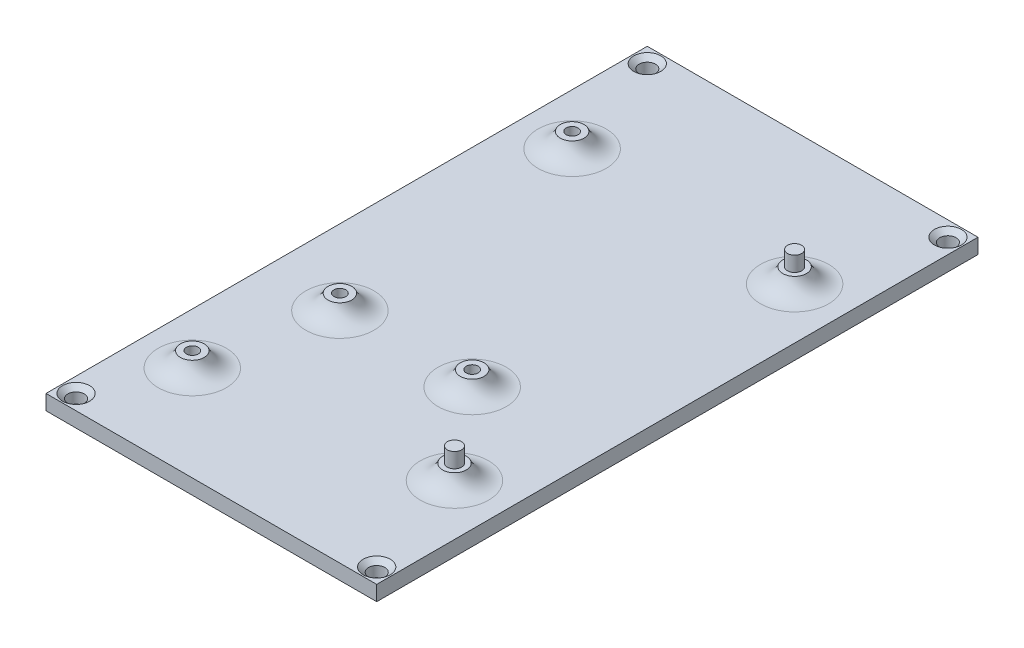
ISO-10303-21;
HEADER;
FILE_DESCRIPTION(('STEP AP214'),'2;1');
FILE_NAME('part.step','',(''),(''),'','','');
FILE_SCHEMA(('AUTOMOTIVE_DESIGN { 1 0 10303 214 1 1 1 1 }'));
ENDSEC;
DATA;
#1=APPLICATION_CONTEXT('core data for automotive mechanical design processes');
#2=APPLICATION_PROTOCOL_DEFINITION('international standard','automotive_design',2000,#1);
#3=PRODUCT_CONTEXT('',#1,'mechanical');
#4=PRODUCT('Part','Part','',(#3));
#5=PRODUCT_RELATED_PRODUCT_CATEGORY('part','',(#4));
#6=PRODUCT_DEFINITION_FORMATION('','',#4);
#7=PRODUCT_DEFINITION_CONTEXT('part definition',#1,'design');
#8=PRODUCT_DEFINITION('design','',#6,#7);
#9=PRODUCT_DEFINITION_SHAPE('','',#8);
#10=(LENGTH_UNIT() NAMED_UNIT(*) SI_UNIT(.MILLI.,.METRE.));
#11=(NAMED_UNIT(*) PLANE_ANGLE_UNIT() SI_UNIT($,.RADIAN.));
#12=(NAMED_UNIT(*) SI_UNIT($,.STERADIAN.) SOLID_ANGLE_UNIT());
#13=UNCERTAINTY_MEASURE_WITH_UNIT(LENGTH_MEASURE(1.E-05),#10,'distance_accuracy_value','');
#14=(GEOMETRIC_REPRESENTATION_CONTEXT(3) GLOBAL_UNCERTAINTY_ASSIGNED_CONTEXT((#13)) GLOBAL_UNIT_ASSIGNED_CONTEXT((#10,
#11,#12)) REPRESENTATION_CONTEXT('',''));
#15=CARTESIAN_POINT('',(0.,0.,0.));
#16=DIRECTION('',(0.,0.,1.));
#17=DIRECTION('',(1.,0.,0.));
#18=AXIS2_PLACEMENT_3D('',#15,#16,#17);
#19=CARTESIAN_POINT('',(0.,3.175,0.));
#20=DIRECTION('',(1.,0.,0.));
#21=DIRECTION('',(0.,0.,-1.));
#22=AXIS2_PLACEMENT_3D('',#19,#20,#21);
#23=PLANE('',#22);
#24=DIRECTION('',(0.,0.,1.));
#25=VECTOR('',#24,1.);
#26=CARTESIAN_POINT('',(0.,0.,0.));
#27=LINE('',#26,#25);
#28=CARTESIAN_POINT('',(0.,0.,-127.));
#29=VERTEX_POINT('',#28);
#30=CARTESIAN_POINT('',(0.,0.,0.));
#31=VERTEX_POINT('',#30);
#32=EDGE_CURVE('E115',#29,#31,#27,.T.);
#33=ORIENTED_EDGE('',*,*,#32,.T.);
#34=DIRECTION('',(0.,-1.,0.));
#35=VECTOR('',#34,1.);
#36=CARTESIAN_POINT('',(0.,3.175,0.));
#37=LINE('',#36,#35);
#38=CARTESIAN_POINT('',(0.,3.175,0.));
#39=VERTEX_POINT('',#38);
#40=EDGE_CURVE('E104',#39,#31,#37,.T.);
#41=ORIENTED_EDGE('',*,*,#40,.F.);
#42=DIRECTION('',(0.,0.,1.));
#43=VECTOR('',#42,1.);
#44=CARTESIAN_POINT('',(0.,3.175,0.));
#45=LINE('',#44,#43);
#46=CARTESIAN_POINT('',(0.,3.175,-127.));
#47=VERTEX_POINT('',#46);
#48=EDGE_CURVE('E96',#47,#39,#45,.T.);
#49=ORIENTED_EDGE('',*,*,#48,.F.);
#50=DIRECTION('',(0.,-1.,0.));
#51=VECTOR('',#50,1.);
#52=CARTESIAN_POINT('',(0.,3.175,-127.));
#53=LINE('',#52,#51);
#54=EDGE_CURVE('E111',#47,#29,#53,.T.);
#55=ORIENTED_EDGE('',*,*,#54,.T.);
#56=EDGE_LOOP('',(#33,#41,#49,#55));
#57=FACE_BOUND('',#56,.T.);
#58=ADVANCED_FACE('F42',(#57),#23,.F.);
#59=CARTESIAN_POINT('',(0.,3.175,0.));
#60=DIRECTION('',(0.,0.,-1.));
#61=DIRECTION('',(-1.,0.,0.));
#62=AXIS2_PLACEMENT_3D('',#59,#60,#61);
#63=PLANE('',#62);
#64=DIRECTION('',(1.,0.,0.));
#65=VECTOR('',#64,1.);
#66=CARTESIAN_POINT('',(0.,0.,0.));
#67=LINE('',#66,#65);
#68=CARTESIAN_POINT('',(69.85,0.,0.));
#69=VERTEX_POINT('',#68);
#70=EDGE_CURVE('E102',#31,#69,#67,.T.);
#71=ORIENTED_EDGE('',*,*,#70,.T.);
#72=DIRECTION('',(0.,-1.,0.));
#73=VECTOR('',#72,1.);
#74=CARTESIAN_POINT('',(69.85,3.175,0.));
#75=LINE('',#74,#73);
#76=CARTESIAN_POINT('',(69.85,3.175,0.));
#77=VERTEX_POINT('',#76);
#78=EDGE_CURVE('E100',#77,#69,#75,.T.);
#79=ORIENTED_EDGE('',*,*,#78,.F.);
#80=DIRECTION('',(1.,0.,0.));
#81=VECTOR('',#80,1.);
#82=CARTESIAN_POINT('',(0.,3.175,0.));
#83=LINE('',#82,#81);
#84=EDGE_CURVE('E91',#39,#77,#83,.T.);
#85=ORIENTED_EDGE('',*,*,#84,.F.);
#86=ORIENTED_EDGE('',*,*,#40,.T.);
#87=EDGE_LOOP('',(#71,#79,#85,#86));
#88=FACE_BOUND('',#87,.T.);
#89=ADVANCED_FACE('F101',(#88),#63,.F.);
#90=CARTESIAN_POINT('',(69.85,3.175,0.));
#91=DIRECTION('',(-1.,0.,0.));
#92=DIRECTION('',(0.,0.,1.));
#93=AXIS2_PLACEMENT_3D('',#90,#91,#92);
#94=PLANE('',#93);
#95=DIRECTION('',(0.,0.,-1.));
#96=VECTOR('',#95,1.);
#97=CARTESIAN_POINT('',(69.85,0.,0.));
#98=LINE('',#97,#96);
#99=CARTESIAN_POINT('',(69.85,0.,-127.));
#100=VERTEX_POINT('',#99);
#101=EDGE_CURVE('E77',#69,#100,#98,.T.);
#102=ORIENTED_EDGE('',*,*,#101,.T.);
#103=DIRECTION('',(0.,-1.,0.));
#104=VECTOR('',#103,1.);
#105=CARTESIAN_POINT('',(69.85,3.175,-127.));
#106=LINE('',#105,#104);
#107=CARTESIAN_POINT('',(69.85,3.175,-127.));
#108=VERTEX_POINT('',#107);
#109=EDGE_CURVE('E105',#108,#100,#106,.T.);
#110=ORIENTED_EDGE('',*,*,#109,.F.);
#111=DIRECTION('',(0.,0.,-1.));
#112=VECTOR('',#111,1.);
#113=CARTESIAN_POINT('',(69.85,3.175,0.));
#114=LINE('',#113,#112);
#115=EDGE_CURVE('E94',#77,#108,#114,.T.);
#116=ORIENTED_EDGE('',*,*,#115,.F.);
#117=ORIENTED_EDGE('',*,*,#78,.T.);
#118=EDGE_LOOP('',(#102,#110,#116,#117));
#119=FACE_BOUND('',#118,.T.);
#120=ADVANCED_FACE('F107',(#119),#94,.F.);
#121=CARTESIAN_POINT('',(0.,3.175,-127.));
#122=DIRECTION('',(0.,0.,1.));
#123=DIRECTION('',(1.,0.,0.));
#124=AXIS2_PLACEMENT_3D('',#121,#122,#123);
#125=PLANE('',#124);
#126=DIRECTION('',(-1.,0.,0.));
#127=VECTOR('',#126,1.);
#128=CARTESIAN_POINT('',(0.,0.,-127.));
#129=LINE('',#128,#127);
#130=EDGE_CURVE('E83',#100,#29,#129,.T.);
#131=ORIENTED_EDGE('',*,*,#130,.T.);
#132=ORIENTED_EDGE('',*,*,#54,.F.);
#133=DIRECTION('',(-1.,0.,0.));
#134=VECTOR('',#133,1.);
#135=CARTESIAN_POINT('',(0.,3.175,-127.));
#136=LINE('',#135,#134);
#137=EDGE_CURVE('E60',#108,#47,#136,.T.);
#138=ORIENTED_EDGE('',*,*,#137,.F.);
#139=ORIENTED_EDGE('',*,*,#109,.T.);
#140=EDGE_LOOP('',(#131,#132,#138,#139));
#141=FACE_BOUND('',#140,.T.);
#142=ADVANCED_FACE('F246',(#141),#125,.F.);
#143=CARTESIAN_POINT('',(0.,3.175,0.));
#144=DIRECTION('',(0.,-1.,0.));
#145=DIRECTION('',(0.,0.,-1.));
#146=AXIS2_PLACEMENT_3D('',#143,#144,#145);
#147=PLANE('',#146);
#148=CARTESIAN_POINT('',(59.055,3.175,-27.2169857965139));
#149=DIRECTION('',(0.,-1.,0.));
#150=DIRECTION('',(0.,0.,-1.));
#151=AXIS2_PLACEMENT_3D('',#148,#149,#150);
#152=CIRCLE('',#151,7.20928603930575);
#153=CARTESIAN_POINT('',(59.055,3.175,-34.4262718358196));
#154=VERTEX_POINT('',#153);
#155=EDGE_CURVE('E11',#154,#154,#152,.T.);
#156=ORIENTED_EDGE('',*,*,#155,.T.);
#157=EDGE_LOOP('',(#156));
#158=FACE_BOUND('',#157,.T.);
#159=CARTESIAN_POINT('',(43.815,3.175,-46.1985789495998));
#160=DIRECTION('',(0.,-1.,0.));
#161=DIRECTION('',(0.,0.,-1.));
#162=AXIS2_PLACEMENT_3D('',#159,#160,#161);
#163=CIRCLE('',#162,7.20928603930575);
#164=CARTESIAN_POINT('',(43.815,3.175,-53.4078649889055));
#165=VERTEX_POINT('',#164);
#166=EDGE_CURVE('E52',#165,#165,#163,.T.);
#167=ORIENTED_EDGE('',*,*,#166,.T.);
#168=EDGE_LOOP('',(#167));
#169=FACE_BOUND('',#168,.T.);
#170=CARTESIAN_POINT('',(10.795,3.175,-20.1028624563548));
#171=DIRECTION('',(0.,-1.,0.));
#172=DIRECTION('',(0.,0.,-1.));
#173=AXIS2_PLACEMENT_3D('',#170,#171,#172);
#174=CIRCLE('',#173,7.20928603930574);
#175=CARTESIAN_POINT('',(10.795,3.175,-27.3121484956606));
#176=VERTEX_POINT('',#175);
#177=EDGE_CURVE('E146',#176,#176,#174,.T.);
#178=ORIENTED_EDGE('',*,*,#177,.T.);
#179=EDGE_LOOP('',(#178));
#180=FACE_BOUND('',#179,.T.);
#181=CARTESIAN_POINT('',(15.875,3.175,-46.1985789495998));
#182=DIRECTION('',(0.,-1.,0.));
#183=DIRECTION('',(0.,0.,-1.));
#184=AXIS2_PLACEMENT_3D('',#181,#182,#183);
#185=CIRCLE('',#184,7.20928603930575);
#186=CARTESIAN_POINT('',(15.875,3.175,-53.4078649889055));
#187=VERTEX_POINT('',#186);
#188=EDGE_CURVE('E142',#187,#187,#185,.T.);
#189=ORIENTED_EDGE('',*,*,#188,.T.);
#190=EDGE_LOOP('',(#189));
#191=FACE_BOUND('',#190,.T.);
#192=CARTESIAN_POINT('',(59.055,3.175,-99.06));
#193=DIRECTION('',(0.,-1.,0.));
#194=DIRECTION('',(0.,0.,-1.));
#195=AXIS2_PLACEMENT_3D('',#192,#193,#194);
#196=CIRCLE('',#195,7.20928603930575);
#197=CARTESIAN_POINT('',(59.055,3.175,-106.269286039306));
#198=VERTEX_POINT('',#197);
#199=EDGE_CURVE('E137',#198,#198,#196,.T.);
#200=ORIENTED_EDGE('',*,*,#199,.T.);
#201=EDGE_LOOP('',(#200));
#202=FACE_BOUND('',#201,.T.);
#203=CARTESIAN_POINT('',(10.795,3.175,-100.33));
#204=DIRECTION('',(0.,-1.,0.));
#205=DIRECTION('',(0.,0.,-1.));
#206=AXIS2_PLACEMENT_3D('',#203,#204,#205);
#207=CIRCLE('',#206,7.20928603930575);
#208=CARTESIAN_POINT('',(10.795,3.175,-107.539286039306));
#209=VERTEX_POINT('',#208);
#210=EDGE_CURVE('E133',#209,#209,#207,.T.);
#211=ORIENTED_EDGE('',*,*,#210,.T.);
#212=EDGE_LOOP('',(#211));
#213=FACE_BOUND('',#212,.T.);
#214=CARTESIAN_POINT('',(3.175,3.175,-123.825));
#215=DIRECTION('',(0.,1.,0.));
#216=DIRECTION('',(0.,0.,1.));
#217=AXIS2_PLACEMENT_3D('',#214,#215,#216);
#218=CIRCLE('',#217,2.8575);
#219=CARTESIAN_POINT('',(3.175,3.175,-120.9675));
#220=VERTEX_POINT('',#219);
#221=EDGE_CURVE('E580',#220,#220,#218,.T.);
#222=ORIENTED_EDGE('',*,*,#221,.F.);
#223=EDGE_LOOP('',(#222));
#224=FACE_BOUND('',#223,.T.);
#225=CARTESIAN_POINT('',(66.675,3.175,-123.825));
#226=DIRECTION('',(0.,1.,0.));
#227=DIRECTION('',(0.,0.,1.));
#228=AXIS2_PLACEMENT_3D('',#225,#226,#227);
#229=CIRCLE('',#228,2.8575);
#230=CARTESIAN_POINT('',(66.675,3.175,-120.9675));
#231=VERTEX_POINT('',#230);
#232=EDGE_CURVE('E568',#231,#231,#229,.T.);
#233=ORIENTED_EDGE('',*,*,#232,.F.);
#234=EDGE_LOOP('',(#233));
#235=FACE_BOUND('',#234,.T.);
#236=CARTESIAN_POINT('',(66.675,3.175,-3.175));
#237=DIRECTION('',(0.,1.,0.));
#238=DIRECTION('',(0.,0.,1.));
#239=AXIS2_PLACEMENT_3D('',#236,#237,#238);
#240=CIRCLE('',#239,2.8575);
#241=CARTESIAN_POINT('',(66.675,3.175,-0.317500000000001));
#242=VERTEX_POINT('',#241);
#243=EDGE_CURVE('E556',#242,#242,#240,.T.);
#244=ORIENTED_EDGE('',*,*,#243,.F.);
#245=EDGE_LOOP('',(#244));
#246=FACE_BOUND('',#245,.T.);
#247=CARTESIAN_POINT('',(3.175,3.175,-3.175));
#248=DIRECTION('',(0.,1.,0.));
#249=DIRECTION('',(0.,0.,1.));
#250=AXIS2_PLACEMENT_3D('',#247,#248,#249);
#251=CIRCLE('',#250,2.8575);
#252=CARTESIAN_POINT('',(3.175,3.175,-0.317499999999997));
#253=VERTEX_POINT('',#252);
#254=EDGE_CURVE('E544',#253,#253,#251,.T.);
#255=ORIENTED_EDGE('',*,*,#254,.F.);
#256=EDGE_LOOP('',(#255));
#257=FACE_BOUND('',#256,.T.);
#258=ORIENTED_EDGE('',*,*,#48,.T.);
#259=ORIENTED_EDGE('',*,*,#84,.T.);
#260=ORIENTED_EDGE('',*,*,#115,.T.);
#261=ORIENTED_EDGE('',*,*,#137,.T.);
#262=EDGE_LOOP('',(#258,#259,#260,#261));
#263=FACE_BOUND('',#262,.T.);
#264=ADVANCED_FACE('F92',(#158,#169,#180,#191,#202,#213,#224,#235,#246,#257,#263),#147,.F.);
#265=CARTESIAN_POINT('',(0.,0.,0.));
#266=DIRECTION('',(0.,-1.,0.));
#267=DIRECTION('',(0.,0.,-1.));
#268=AXIS2_PLACEMENT_3D('',#265,#266,#267);
#269=PLANE('',#268);
#270=CARTESIAN_POINT('',(3.175,0.,-123.825));
#271=DIRECTION('',(0.,1.,0.));
#272=DIRECTION('',(0.,0.,1.));
#273=AXIS2_PLACEMENT_3D('',#270,#271,#272);
#274=CIRCLE('',#273,1.7272);
#275=CARTESIAN_POINT('',(3.175,0.,-122.0978));
#276=VERTEX_POINT('',#275);
#277=EDGE_CURVE('E572',#276,#276,#274,.T.);
#278=ORIENTED_EDGE('',*,*,#277,.T.);
#279=EDGE_LOOP('',(#278));
#280=FACE_BOUND('',#279,.T.);
#281=CARTESIAN_POINT('',(66.675,0.,-123.825));
#282=DIRECTION('',(0.,1.,0.));
#283=DIRECTION('',(0.,0.,1.));
#284=AXIS2_PLACEMENT_3D('',#281,#282,#283);
#285=CIRCLE('',#284,1.7272);
#286=CARTESIAN_POINT('',(66.675,0.,-122.0978));
#287=VERTEX_POINT('',#286);
#288=EDGE_CURVE('E560',#287,#287,#285,.T.);
#289=ORIENTED_EDGE('',*,*,#288,.T.);
#290=EDGE_LOOP('',(#289));
#291=FACE_BOUND('',#290,.T.);
#292=CARTESIAN_POINT('',(66.675,0.,-3.175));
#293=DIRECTION('',(0.,1.,0.));
#294=DIRECTION('',(0.,0.,1.));
#295=AXIS2_PLACEMENT_3D('',#292,#293,#294);
#296=CIRCLE('',#295,1.7272);
#297=CARTESIAN_POINT('',(66.675,0.,-1.4478));
#298=VERTEX_POINT('',#297);
#299=EDGE_CURVE('E548',#298,#298,#296,.T.);
#300=ORIENTED_EDGE('',*,*,#299,.T.);
#301=EDGE_LOOP('',(#300));
#302=FACE_BOUND('',#301,.T.);
#303=CARTESIAN_POINT('',(3.175,0.,-3.175));
#304=DIRECTION('',(0.,1.,0.));
#305=DIRECTION('',(0.,0.,1.));
#306=AXIS2_PLACEMENT_3D('',#303,#304,#305);
#307=CIRCLE('',#306,1.7272);
#308=CARTESIAN_POINT('',(3.175,0.,-1.4478));
#309=VERTEX_POINT('',#308);
#310=EDGE_CURVE('E536',#309,#309,#307,.T.);
#311=ORIENTED_EDGE('',*,*,#310,.T.);
#312=EDGE_LOOP('',(#311));
#313=FACE_BOUND('',#312,.T.);
#314=CARTESIAN_POINT('',(10.795,0.,-100.33));
#315=DIRECTION('',(0.,1.,0.));
#316=DIRECTION('',(0.,0.,1.));
#317=AXIS2_PLACEMENT_3D('',#314,#315,#316);
#318=CIRCLE('',#317,1.25);
#319=CARTESIAN_POINT('',(10.795,0.,-99.08));
#320=VERTEX_POINT('',#319);
#321=EDGE_CURVE('E514',#320,#320,#318,.T.);
#322=ORIENTED_EDGE('',*,*,#321,.T.);
#323=EDGE_LOOP('',(#322));
#324=FACE_BOUND('',#323,.T.);
#325=CARTESIAN_POINT('',(15.875,0.,-46.1985789495998));
#326=DIRECTION('',(0.,1.,0.));
#327=DIRECTION('',(0.,0.,1.));
#328=AXIS2_PLACEMENT_3D('',#325,#326,#327);
#329=CIRCLE('',#328,1.25);
#330=CARTESIAN_POINT('',(15.875,0.,-44.9485789495998));
#331=VERTEX_POINT('',#330);
#332=EDGE_CURVE('E506',#331,#331,#329,.T.);
#333=ORIENTED_EDGE('',*,*,#332,.T.);
#334=EDGE_LOOP('',(#333));
#335=FACE_BOUND('',#334,.T.);
#336=CARTESIAN_POINT('',(43.815,0.,-46.1985789495998));
#337=DIRECTION('',(0.,1.,0.));
#338=DIRECTION('',(0.,0.,1.));
#339=AXIS2_PLACEMENT_3D('',#336,#337,#338);
#340=CIRCLE('',#339,1.24999999999999);
#341=CARTESIAN_POINT('',(43.815,0.,-44.9485789495998));
#342=VERTEX_POINT('',#341);
#343=EDGE_CURVE('E488',#342,#342,#340,.T.);
#344=ORIENTED_EDGE('',*,*,#343,.T.);
#345=EDGE_LOOP('',(#344));
#346=FACE_BOUND('',#345,.T.);
#347=CARTESIAN_POINT('',(10.795,0.,-20.1028624563548));
#348=DIRECTION('',(0.,1.,0.));
#349=DIRECTION('',(0.,0.,1.));
#350=AXIS2_PLACEMENT_3D('',#347,#348,#349);
#351=CIRCLE('',#350,1.25);
#352=CARTESIAN_POINT('',(10.795,0.,-18.8528624563548));
#353=VERTEX_POINT('',#352);
#354=EDGE_CURVE('E487',#353,#353,#351,.T.);
#355=ORIENTED_EDGE('',*,*,#354,.T.);
#356=EDGE_LOOP('',(#355));
#357=FACE_BOUND('',#356,.T.);
#358=ORIENTED_EDGE('',*,*,#32,.F.);
#359=ORIENTED_EDGE('',*,*,#130,.F.);
#360=ORIENTED_EDGE('',*,*,#101,.F.);
#361=ORIENTED_EDGE('',*,*,#70,.F.);
#362=EDGE_LOOP('',(#358,#359,#360,#361));
#363=FACE_BOUND('',#362,.T.);
#364=ADVANCED_FACE('F242',(#280,#291,#302,#313,#324,#335,#346,#357,#363),#269,.T.);
#365=CARTESIAN_POINT('',(10.795,6.35,-100.33));
#366=DIRECTION('',(0.,1.,0.));
#367=DIRECTION('',(0.,0.,1.));
#368=AXIS2_PLACEMENT_3D('',#365,#366,#367);
#369=PLANE('',#368);
#370=CARTESIAN_POINT('',(10.795,6.35,-100.33));
#371=DIRECTION('',(0.,1.,0.));
#372=DIRECTION('',(0.,0.,1.));
#373=AXIS2_PLACEMENT_3D('',#370,#371,#372);
#374=CIRCLE('',#373,1.25);
#375=CARTESIAN_POINT('',(10.795,6.35,-99.08));
#376=VERTEX_POINT('',#375);
#377=EDGE_CURVE('E518',#376,#376,#374,.T.);
#378=ORIENTED_EDGE('',*,*,#377,.F.);
#379=EDGE_LOOP('',(#378));
#380=FACE_BOUND('',#379,.T.);
#381=CARTESIAN_POINT('',(10.795,6.35,-100.33));
#382=DIRECTION('',(0.,1.,0.));
#383=DIRECTION('',(0.,0.,1.));
#384=AXIS2_PLACEMENT_3D('',#381,#382,#383);
#385=CIRCLE('',#384,2.5);
#386=CARTESIAN_POINT('',(10.795,6.35,-97.83));
#387=VERTEX_POINT('',#386);
#388=EDGE_CURVE('E119',#387,#387,#385,.T.);
#389=ORIENTED_EDGE('',*,*,#388,.T.);
#390=EDGE_LOOP('',(#389));
#391=FACE_BOUND('',#390,.T.);
#392=ADVANCED_FACE('F187',(#380,#391),#369,.T.);
#393=CARTESIAN_POINT('',(59.055,6.35,-99.06));
#394=DIRECTION('',(0.,1.,0.));
#395=DIRECTION('',(0.,0.,1.));
#396=AXIS2_PLACEMENT_3D('',#393,#394,#395);
#397=PLANE('',#396);
#398=CARTESIAN_POINT('',(59.055,6.35,-99.06));
#399=DIRECTION('',(0.,1.,0.));
#400=DIRECTION('',(0.,0.,1.));
#401=AXIS2_PLACEMENT_3D('',#398,#399,#400);
#402=CIRCLE('',#401,1.5);
#403=CARTESIAN_POINT('',(59.055,6.35,-97.56));
#404=VERTEX_POINT('',#403);
#405=EDGE_CURVE('E132',#404,#404,#402,.T.);
#406=ORIENTED_EDGE('',*,*,#405,.F.);
#407=EDGE_LOOP('',(#406));
#408=FACE_BOUND('',#407,.T.);
#409=CARTESIAN_POINT('',(59.055,6.35,-99.06));
#410=DIRECTION('',(0.,1.,0.));
#411=DIRECTION('',(0.,0.,1.));
#412=AXIS2_PLACEMENT_3D('',#409,#410,#411);
#413=CIRCLE('',#412,2.5);
#414=CARTESIAN_POINT('',(59.055,6.35,-96.56));
#415=VERTEX_POINT('',#414);
#416=EDGE_CURVE('E172',#415,#415,#413,.T.);
#417=ORIENTED_EDGE('',*,*,#416,.T.);
#418=EDGE_LOOP('',(#417));
#419=FACE_BOUND('',#418,.T.);
#420=ADVANCED_FACE('F225',(#408,#419),#397,.T.);
#421=CARTESIAN_POINT('',(15.875,6.35,-46.1985789495998));
#422=DIRECTION('',(0.,1.,0.));
#423=DIRECTION('',(0.,0.,1.));
#424=AXIS2_PLACEMENT_3D('',#421,#422,#423);
#425=PLANE('',#424);
#426=CARTESIAN_POINT('',(15.875,6.35,-46.1985789495998));
#427=DIRECTION('',(0.,1.,0.));
#428=DIRECTION('',(0.,0.,1.));
#429=AXIS2_PLACEMENT_3D('',#426,#427,#428);
#430=CIRCLE('',#429,1.25);
#431=CARTESIAN_POINT('',(15.875,6.35,-44.9485789495998));
#432=VERTEX_POINT('',#431);
#433=EDGE_CURVE('E510',#432,#432,#430,.T.);
#434=ORIENTED_EDGE('',*,*,#433,.F.);
#435=EDGE_LOOP('',(#434));
#436=FACE_BOUND('',#435,.T.);
#437=CARTESIAN_POINT('',(15.875,6.35,-46.1985789495998));
#438=DIRECTION('',(0.,1.,0.));
#439=DIRECTION('',(0.,0.,1.));
#440=AXIS2_PLACEMENT_3D('',#437,#438,#439);
#441=CIRCLE('',#440,2.5);
#442=CARTESIAN_POINT('',(15.875,6.35,-43.6985789495998));
#443=VERTEX_POINT('',#442);
#444=EDGE_CURVE('E166',#443,#443,#441,.T.);
#445=ORIENTED_EDGE('',*,*,#444,.T.);
#446=EDGE_LOOP('',(#445));
#447=FACE_BOUND('',#446,.T.);
#448=ADVANCED_FACE('F222',(#436,#447),#425,.T.);
#449=CARTESIAN_POINT('',(43.815,6.35,-46.1985789495998));
#450=DIRECTION('',(0.,1.,0.));
#451=DIRECTION('',(0.,0.,1.));
#452=AXIS2_PLACEMENT_3D('',#449,#450,#451);
#453=PLANE('',#452);
#454=CARTESIAN_POINT('',(43.815,6.35,-46.1985789495998));
#455=DIRECTION('',(0.,1.,0.));
#456=DIRECTION('',(0.,0.,1.));
#457=AXIS2_PLACEMENT_3D('',#454,#455,#456);
#458=CIRCLE('',#457,1.25);
#459=CARTESIAN_POINT('',(43.815,6.35,-44.9485789495998));
#460=VERTEX_POINT('',#459);
#461=EDGE_CURVE('E495',#460,#460,#458,.T.);
#462=ORIENTED_EDGE('',*,*,#461,.F.);
#463=EDGE_LOOP('',(#462));
#464=FACE_BOUND('',#463,.T.);
#465=CARTESIAN_POINT('',(43.815,6.35,-46.1985789495998));
#466=DIRECTION('',(0.,1.,0.));
#467=DIRECTION('',(0.,0.,1.));
#468=AXIS2_PLACEMENT_3D('',#465,#466,#467);
#469=CIRCLE('',#468,2.5);
#470=CARTESIAN_POINT('',(43.815,6.35,-43.6985789495998));
#471=VERTEX_POINT('',#470);
#472=EDGE_CURVE('E163',#471,#471,#469,.T.);
#473=ORIENTED_EDGE('',*,*,#472,.T.);
#474=EDGE_LOOP('',(#473));
#475=FACE_BOUND('',#474,.T.);
#476=ADVANCED_FACE('F224',(#464,#475),#453,.T.);
#477=CARTESIAN_POINT('',(10.795,6.35,-20.1028624563548));
#478=DIRECTION('',(0.,1.,0.));
#479=DIRECTION('',(0.,0.,1.));
#480=AXIS2_PLACEMENT_3D('',#477,#478,#479);
#481=PLANE('',#480);
#482=CARTESIAN_POINT('',(10.795,6.35,-20.1028624563548));
#483=DIRECTION('',(0.,1.,0.));
#484=DIRECTION('',(0.,0.,1.));
#485=AXIS2_PLACEMENT_3D('',#482,#483,#484);
#486=CIRCLE('',#485,1.25);
#487=CARTESIAN_POINT('',(10.795,6.35,-18.8528624563548));
#488=VERTEX_POINT('',#487);
#489=EDGE_CURVE('E482',#488,#488,#486,.T.);
#490=ORIENTED_EDGE('',*,*,#489,.F.);
#491=EDGE_LOOP('',(#490));
#492=FACE_BOUND('',#491,.T.);
#493=CARTESIAN_POINT('',(10.795,6.35,-20.1028624563548));
#494=DIRECTION('',(0.,1.,0.));
#495=DIRECTION('',(0.,0.,1.));
#496=AXIS2_PLACEMENT_3D('',#493,#494,#495);
#497=CIRCLE('',#496,2.5);
#498=CARTESIAN_POINT('',(10.795,6.35,-17.6028624563548));
#499=VERTEX_POINT('',#498);
#500=EDGE_CURVE('E167',#499,#499,#497,.T.);
#501=ORIENTED_EDGE('',*,*,#500,.T.);
#502=EDGE_LOOP('',(#501));
#503=FACE_BOUND('',#502,.T.);
#504=ADVANCED_FACE('F232',(#492,#503),#481,.T.);
#505=CARTESIAN_POINT('',(59.055,6.35,-27.2169857965139));
#506=DIRECTION('',(0.,1.,0.));
#507=DIRECTION('',(0.,0.,1.));
#508=AXIS2_PLACEMENT_3D('',#505,#506,#507);
#509=PLANE('',#508);
#510=CARTESIAN_POINT('',(59.055,6.35,-27.2169857965139));
#511=DIRECTION('',(0.,1.,0.));
#512=DIRECTION('',(0.,0.,1.));
#513=AXIS2_PLACEMENT_3D('',#510,#511,#512);
#514=CIRCLE('',#513,1.5);
#515=CARTESIAN_POINT('',(59.055,6.35,-25.7169857965139));
#516=VERTEX_POINT('',#515);
#517=EDGE_CURVE('E138',#516,#516,#514,.T.);
#518=ORIENTED_EDGE('',*,*,#517,.F.);
#519=EDGE_LOOP('',(#518));
#520=FACE_BOUND('',#519,.T.);
#521=CARTESIAN_POINT('',(59.055,6.35,-27.2169857965139));
#522=DIRECTION('',(0.,1.,0.));
#523=DIRECTION('',(0.,0.,1.));
#524=AXIS2_PLACEMENT_3D('',#521,#522,#523);
#525=CIRCLE('',#524,2.5);
#526=CARTESIAN_POINT('',(59.055,6.35,-24.7169857965139));
#527=VERTEX_POINT('',#526);
#528=EDGE_CURVE('E175',#527,#527,#525,.T.);
#529=ORIENTED_EDGE('',*,*,#528,.T.);
#530=EDGE_LOOP('',(#529));
#531=FACE_BOUND('',#530,.T.);
#532=ADVANCED_FACE('F300',(#520,#531),#509,.T.);
#533=CARTESIAN_POINT('',(10.795,6.35,-20.1028624563548));
#534=DIRECTION('',(0.,1.,0.));
#535=DIRECTION('',(0.,0.,1.));
#536=AXIS2_PLACEMENT_3D('',#533,#534,#535);
#537=CYLINDRICAL_SURFACE('',#536,1.25);
#538=ORIENTED_EDGE('',*,*,#354,.F.);
#539=EDGE_LOOP('',(#538));
#540=FACE_BOUND('',#539,.T.);
#541=ORIENTED_EDGE('',*,*,#489,.T.);
#542=EDGE_LOOP('',(#541));
#543=FACE_BOUND('',#542,.T.);
#544=ADVANCED_FACE('F305',(#540,#543),#537,.F.);
#545=CARTESIAN_POINT('',(43.815,6.35,-46.1985789495998));
#546=DIRECTION('',(0.,1.,0.));
#547=DIRECTION('',(0.,0.,1.));
#548=AXIS2_PLACEMENT_3D('',#545,#546,#547);
#549=CYLINDRICAL_SURFACE('',#548,1.25);
#550=ORIENTED_EDGE('',*,*,#343,.F.);
#551=EDGE_LOOP('',(#550));
#552=FACE_BOUND('',#551,.T.);
#553=ORIENTED_EDGE('',*,*,#461,.T.);
#554=EDGE_LOOP('',(#553));
#555=FACE_BOUND('',#554,.T.);
#556=ADVANCED_FACE('F470',(#552,#555),#549,.F.);
#557=CARTESIAN_POINT('',(15.875,6.35,-46.1985789495998));
#558=DIRECTION('',(0.,1.,0.));
#559=DIRECTION('',(0.,0.,1.));
#560=AXIS2_PLACEMENT_3D('',#557,#558,#559);
#561=CYLINDRICAL_SURFACE('',#560,1.25);
#562=ORIENTED_EDGE('',*,*,#332,.F.);
#563=EDGE_LOOP('',(#562));
#564=FACE_BOUND('',#563,.T.);
#565=ORIENTED_EDGE('',*,*,#433,.T.);
#566=EDGE_LOOP('',(#565));
#567=FACE_BOUND('',#566,.T.);
#568=ADVANCED_FACE('F466',(#564,#567),#561,.F.);
#569=CARTESIAN_POINT('',(10.795,6.35,-100.33));
#570=DIRECTION('',(0.,1.,0.));
#571=DIRECTION('',(0.,0.,1.));
#572=AXIS2_PLACEMENT_3D('',#569,#570,#571);
#573=CYLINDRICAL_SURFACE('',#572,1.25);
#574=ORIENTED_EDGE('',*,*,#321,.F.);
#575=EDGE_LOOP('',(#574));
#576=FACE_BOUND('',#575,.T.);
#577=ORIENTED_EDGE('',*,*,#377,.T.);
#578=EDGE_LOOP('',(#577));
#579=FACE_BOUND('',#578,.T.);
#580=ADVANCED_FACE('F295',(#576,#579),#573,.F.);
#581=CARTESIAN_POINT('',(59.055,9.525,-99.06));
#582=DIRECTION('',(0.,-1.,0.));
#583=DIRECTION('',(0.,0.,-1.));
#584=AXIS2_PLACEMENT_3D('',#581,#582,#583);
#585=CYLINDRICAL_SURFACE('',#584,1.5);
#586=CARTESIAN_POINT('',(59.055,9.525,-99.06));
#587=DIRECTION('',(0.,1.,0.));
#588=DIRECTION('',(0.,0.,1.));
#589=AXIS2_PLACEMENT_3D('',#586,#587,#588);
#590=CIRCLE('',#589,1.5);
#591=CARTESIAN_POINT('',(59.055,9.525,-97.56));
#592=VERTEX_POINT('',#591);
#593=EDGE_CURVE('E522',#592,#592,#590,.T.);
#594=ORIENTED_EDGE('',*,*,#593,.F.);
#595=EDGE_LOOP('',(#594));
#596=FACE_BOUND('',#595,.T.);
#597=ORIENTED_EDGE('',*,*,#405,.T.);
#598=EDGE_LOOP('',(#597));
#599=FACE_BOUND('',#598,.T.);
#600=ADVANCED_FACE('F315',(#596,#599),#585,.T.);
#601=CARTESIAN_POINT('',(59.055,9.525,-99.06));
#602=DIRECTION('',(0.,1.,0.));
#603=DIRECTION('',(0.,0.,1.));
#604=AXIS2_PLACEMENT_3D('',#601,#602,#603);
#605=PLANE('',#604);
#606=ORIENTED_EDGE('',*,*,#593,.T.);
#607=EDGE_LOOP('',(#606));
#608=FACE_BOUND('',#607,.T.);
#609=ADVANCED_FACE('F320',(#608),#605,.T.);
#610=CARTESIAN_POINT('',(59.055,9.525,-27.2169857965139));
#611=DIRECTION('',(0.,-1.,0.));
#612=DIRECTION('',(0.,0.,-1.));
#613=AXIS2_PLACEMENT_3D('',#610,#611,#612);
#614=CYLINDRICAL_SURFACE('',#613,1.5);
#615=CARTESIAN_POINT('',(59.055,9.525,-27.2169857965139));
#616=DIRECTION('',(0.,1.,0.));
#617=DIRECTION('',(0.,0.,1.));
#618=AXIS2_PLACEMENT_3D('',#615,#616,#617);
#619=CIRCLE('',#618,1.5);
#620=CARTESIAN_POINT('',(59.055,9.525,-25.7169857965139));
#621=VERTEX_POINT('',#620);
#622=EDGE_CURVE('E529',#621,#621,#619,.T.);
#623=ORIENTED_EDGE('',*,*,#622,.F.);
#624=EDGE_LOOP('',(#623));
#625=FACE_BOUND('',#624,.T.);
#626=ORIENTED_EDGE('',*,*,#517,.T.);
#627=EDGE_LOOP('',(#626));
#628=FACE_BOUND('',#627,.T.);
#629=ADVANCED_FACE('F331',(#625,#628),#614,.T.);
#630=CARTESIAN_POINT('',(59.055,9.525,-27.2169857965139));
#631=DIRECTION('',(0.,1.,0.));
#632=DIRECTION('',(0.,0.,1.));
#633=AXIS2_PLACEMENT_3D('',#630,#631,#632);
#634=PLANE('',#633);
#635=ORIENTED_EDGE('',*,*,#622,.T.);
#636=EDGE_LOOP('',(#635));
#637=FACE_BOUND('',#636,.T.);
#638=ADVANCED_FACE('F340',(#637),#634,.T.);
#639=CARTESIAN_POINT('',(3.175,3.175,-3.175));
#640=DIRECTION('',(0.,1.,0.));
#641=DIRECTION('',(0.,0.,1.));
#642=AXIS2_PLACEMENT_3D('',#639,#640,#641);
#643=CYLINDRICAL_SURFACE('',#642,1.7272);
#644=ORIENTED_EDGE('',*,*,#310,.F.);
#645=EDGE_LOOP('',(#644));
#646=FACE_BOUND('',#645,.T.);
#647=CARTESIAN_POINT('',(3.175,2.22656568688032,-3.175));
#648=DIRECTION('',(0.,1.,0.));
#649=DIRECTION('',(0.,0.,1.));
#650=AXIS2_PLACEMENT_3D('',#647,#648,#649);
#651=CIRCLE('',#650,1.7272);
#652=CARTESIAN_POINT('',(3.175,2.22656568688032,-1.4478));
#653=VERTEX_POINT('',#652);
#654=EDGE_CURVE('E540',#653,#653,#651,.T.);
#655=ORIENTED_EDGE('',*,*,#654,.T.);
#656=EDGE_LOOP('',(#655));
#657=FACE_BOUND('',#656,.T.);
#658=ADVANCED_FACE('F349',(#646,#657),#643,.F.);
#659=CARTESIAN_POINT('',(3.175,3.175,-3.175));
#660=DIRECTION('',(0.,1.,0.));
#661=DIRECTION('',(0.,0.,1.));
#662=AXIS2_PLACEMENT_3D('',#659,#660,#661);
#663=CONICAL_SURFACE('',#662,2.8575,0.872664625997165);
#664=ORIENTED_EDGE('',*,*,#654,.F.);
#665=EDGE_LOOP('',(#664));
#666=FACE_BOUND('',#665,.T.);
#667=ORIENTED_EDGE('',*,*,#254,.T.);
#668=EDGE_LOOP('',(#667));
#669=FACE_BOUND('',#668,.T.);
#670=ADVANCED_FACE('F359',(#666,#669),#663,.F.);
#671=CARTESIAN_POINT('',(66.675,3.175,-3.175));
#672=DIRECTION('',(0.,1.,0.));
#673=DIRECTION('',(0.,0.,1.));
#674=AXIS2_PLACEMENT_3D('',#671,#672,#673);
#675=CYLINDRICAL_SURFACE('',#674,1.7272);
#676=ORIENTED_EDGE('',*,*,#299,.F.);
#677=EDGE_LOOP('',(#676));
#678=FACE_BOUND('',#677,.T.);
#679=CARTESIAN_POINT('',(66.675,2.22656568688032,-3.175));
#680=DIRECTION('',(0.,1.,0.));
#681=DIRECTION('',(0.,0.,1.));
#682=AXIS2_PLACEMENT_3D('',#679,#680,#681);
#683=CIRCLE('',#682,1.7272);
#684=CARTESIAN_POINT('',(66.675,2.22656568688032,-1.4478));
#685=VERTEX_POINT('',#684);
#686=EDGE_CURVE('E552',#685,#685,#683,.T.);
#687=ORIENTED_EDGE('',*,*,#686,.T.);
#688=EDGE_LOOP('',(#687));
#689=FACE_BOUND('',#688,.T.);
#690=ADVANCED_FACE('F366',(#678,#689),#675,.F.);
#691=CARTESIAN_POINT('',(66.675,3.175,-3.175));
#692=DIRECTION('',(0.,1.,0.));
#693=DIRECTION('',(0.,0.,1.));
#694=AXIS2_PLACEMENT_3D('',#691,#692,#693);
#695=CONICAL_SURFACE('',#694,2.8575,0.872664625997164);
#696=ORIENTED_EDGE('',*,*,#686,.F.);
#697=EDGE_LOOP('',(#696));
#698=FACE_BOUND('',#697,.T.);
#699=ORIENTED_EDGE('',*,*,#243,.T.);
#700=EDGE_LOOP('',(#699));
#701=FACE_BOUND('',#700,.T.);
#702=ADVANCED_FACE('F374',(#698,#701),#695,.F.);
#703=CARTESIAN_POINT('',(66.675,3.175,-123.825));
#704=DIRECTION('',(0.,1.,0.));
#705=DIRECTION('',(0.,0.,1.));
#706=AXIS2_PLACEMENT_3D('',#703,#704,#705);
#707=CYLINDRICAL_SURFACE('',#706,1.7272);
#708=ORIENTED_EDGE('',*,*,#288,.F.);
#709=EDGE_LOOP('',(#708));
#710=FACE_BOUND('',#709,.T.);
#711=CARTESIAN_POINT('',(66.675,2.22656568688032,-123.825));
#712=DIRECTION('',(0.,1.,0.));
#713=DIRECTION('',(0.,0.,1.));
#714=AXIS2_PLACEMENT_3D('',#711,#712,#713);
#715=CIRCLE('',#714,1.7272);
#716=CARTESIAN_POINT('',(66.675,2.22656568688032,-122.0978));
#717=VERTEX_POINT('',#716);
#718=EDGE_CURVE('E564',#717,#717,#715,.T.);
#719=ORIENTED_EDGE('',*,*,#718,.T.);
#720=EDGE_LOOP('',(#719));
#721=FACE_BOUND('',#720,.T.);
#722=ADVANCED_FACE('F382',(#710,#721),#707,.F.);
#723=CARTESIAN_POINT('',(66.675,3.175,-123.825));
#724=DIRECTION('',(0.,1.,0.));
#725=DIRECTION('',(0.,0.,1.));
#726=AXIS2_PLACEMENT_3D('',#723,#724,#725);
#727=CONICAL_SURFACE('',#726,2.8575,0.872664625997164);
#728=ORIENTED_EDGE('',*,*,#718,.F.);
#729=EDGE_LOOP('',(#728));
#730=FACE_BOUND('',#729,.T.);
#731=ORIENTED_EDGE('',*,*,#232,.T.);
#732=EDGE_LOOP('',(#731));
#733=FACE_BOUND('',#732,.T.);
#734=ADVANCED_FACE('F390',(#730,#733),#727,.F.);
#735=CARTESIAN_POINT('',(3.175,3.175,-123.825));
#736=DIRECTION('',(0.,1.,0.));
#737=DIRECTION('',(0.,0.,1.));
#738=AXIS2_PLACEMENT_3D('',#735,#736,#737);
#739=CYLINDRICAL_SURFACE('',#738,1.7272);
#740=ORIENTED_EDGE('',*,*,#277,.F.);
#741=EDGE_LOOP('',(#740));
#742=FACE_BOUND('',#741,.T.);
#743=CARTESIAN_POINT('',(3.175,2.22656568688032,-123.825));
#744=DIRECTION('',(0.,1.,0.));
#745=DIRECTION('',(0.,0.,1.));
#746=AXIS2_PLACEMENT_3D('',#743,#744,#745);
#747=CIRCLE('',#746,1.7272);
#748=CARTESIAN_POINT('',(3.175,2.22656568688032,-122.0978));
#749=VERTEX_POINT('',#748);
#750=EDGE_CURVE('E576',#749,#749,#747,.T.);
#751=ORIENTED_EDGE('',*,*,#750,.T.);
#752=EDGE_LOOP('',(#751));
#753=FACE_BOUND('',#752,.T.);
#754=ADVANCED_FACE('F398',(#742,#753),#739,.F.);
#755=CARTESIAN_POINT('',(3.175,3.175,-123.825));
#756=DIRECTION('',(0.,1.,0.));
#757=DIRECTION('',(0.,0.,1.));
#758=AXIS2_PLACEMENT_3D('',#755,#756,#757);
#759=CONICAL_SURFACE('',#758,2.8575,0.872664625997165);
#760=ORIENTED_EDGE('',*,*,#750,.F.);
#761=EDGE_LOOP('',(#760));
#762=FACE_BOUND('',#761,.T.);
#763=ORIENTED_EDGE('',*,*,#221,.T.);
#764=EDGE_LOOP('',(#763));
#765=FACE_BOUND('',#764,.T.);
#766=ADVANCED_FACE('F208',(#762,#765),#759,.F.);
#767=CARTESIAN_POINT('',(59.055,8.255,-27.2169857965139));
#768=DIRECTION('',(0.,-1.,0.));
#769=DIRECTION('',(0.,0.,-1.));
#770=AXIS2_PLACEMENT_3D('',#767,#768,#769);
#771=TOROIDAL_SURFACE('',#770,7.20928603930575,5.08);
#772=ORIENTED_EDGE('',*,*,#155,.F.);
#773=EDGE_LOOP('',(#772));
#774=FACE_BOUND('',#773,.T.);
#775=ORIENTED_EDGE('',*,*,#528,.F.);
#776=EDGE_LOOP('',(#775));
#777=FACE_BOUND('',#776,.T.);
#778=ADVANCED_FACE('F159',(#774,#777),#771,.F.);
#779=CARTESIAN_POINT('',(43.815,8.255,-46.1985789495998));
#780=DIRECTION('',(0.,-1.,0.));
#781=DIRECTION('',(0.,0.,-1.));
#782=AXIS2_PLACEMENT_3D('',#779,#780,#781);
#783=TOROIDAL_SURFACE('',#782,7.20928603930575,5.08);
#784=ORIENTED_EDGE('',*,*,#166,.F.);
#785=EDGE_LOOP('',(#784));
#786=FACE_BOUND('',#785,.T.);
#787=ORIENTED_EDGE('',*,*,#472,.F.);
#788=EDGE_LOOP('',(#787));
#789=FACE_BOUND('',#788,.T.);
#790=ADVANCED_FACE('F155',(#786,#789),#783,.F.);
#791=CARTESIAN_POINT('',(10.795,8.255,-20.1028624563548));
#792=DIRECTION('',(0.,-1.,0.));
#793=DIRECTION('',(0.,0.,-1.));
#794=AXIS2_PLACEMENT_3D('',#791,#792,#793);
#795=TOROIDAL_SURFACE('',#794,7.20928603930574,5.08);
#796=ORIENTED_EDGE('',*,*,#177,.F.);
#797=EDGE_LOOP('',(#796));
#798=FACE_BOUND('',#797,.T.);
#799=ORIENTED_EDGE('',*,*,#500,.F.);
#800=EDGE_LOOP('',(#799));
#801=FACE_BOUND('',#800,.T.);
#802=ADVANCED_FACE('F158',(#798,#801),#795,.F.);
#803=CARTESIAN_POINT('',(15.875,8.255,-46.1985789495998));
#804=DIRECTION('',(0.,-1.,0.));
#805=DIRECTION('',(0.,0.,-1.));
#806=AXIS2_PLACEMENT_3D('',#803,#804,#805);
#807=TOROIDAL_SURFACE('',#806,7.20928603930575,5.08);
#808=ORIENTED_EDGE('',*,*,#188,.F.);
#809=EDGE_LOOP('',(#808));
#810=FACE_BOUND('',#809,.T.);
#811=ORIENTED_EDGE('',*,*,#444,.F.);
#812=EDGE_LOOP('',(#811));
#813=FACE_BOUND('',#812,.T.);
#814=ADVANCED_FACE('F195',(#810,#813),#807,.F.);
#815=CARTESIAN_POINT('',(59.055,8.255,-99.06));
#816=DIRECTION('',(0.,-1.,0.));
#817=DIRECTION('',(0.,0.,-1.));
#818=AXIS2_PLACEMENT_3D('',#815,#816,#817);
#819=TOROIDAL_SURFACE('',#818,7.20928603930575,5.08);
#820=ORIENTED_EDGE('',*,*,#199,.F.);
#821=EDGE_LOOP('',(#820));
#822=FACE_BOUND('',#821,.T.);
#823=ORIENTED_EDGE('',*,*,#416,.F.);
#824=EDGE_LOOP('',(#823));
#825=FACE_BOUND('',#824,.T.);
#826=ADVANCED_FACE('F190',(#822,#825),#819,.F.);
#827=CARTESIAN_POINT('',(10.795,8.255,-100.33));
#828=DIRECTION('',(0.,-1.,0.));
#829=DIRECTION('',(0.,0.,-1.));
#830=AXIS2_PLACEMENT_3D('',#827,#828,#829);
#831=TOROIDAL_SURFACE('',#830,7.20928603930575,5.08);
#832=ORIENTED_EDGE('',*,*,#210,.F.);
#833=EDGE_LOOP('',(#832));
#834=FACE_BOUND('',#833,.T.);
#835=ORIENTED_EDGE('',*,*,#388,.F.);
#836=EDGE_LOOP('',(#835));
#837=FACE_BOUND('',#836,.T.);
#838=ADVANCED_FACE('F44',(#834,#837),#831,.F.);
#839=CLOSED_SHELL('',(#58,#89,#120,#142,#264,#364,#392,#420,#448,#476,#504,#532,#544,#556,#568,
#580,#600,#609,#629,#638,#658,#670,#690,#702,#722,#734,#754,#766,#778,#790,#802,#814,#826,#838));
#840=MANIFOLD_SOLID_BREP('B2',#839);
#841=ADVANCED_BREP_SHAPE_REPRESENTATION('',(#18,#840),#14);
#842=SHAPE_DEFINITION_REPRESENTATION(#9,#841);
ENDSEC;
END-ISO-10303-21;
